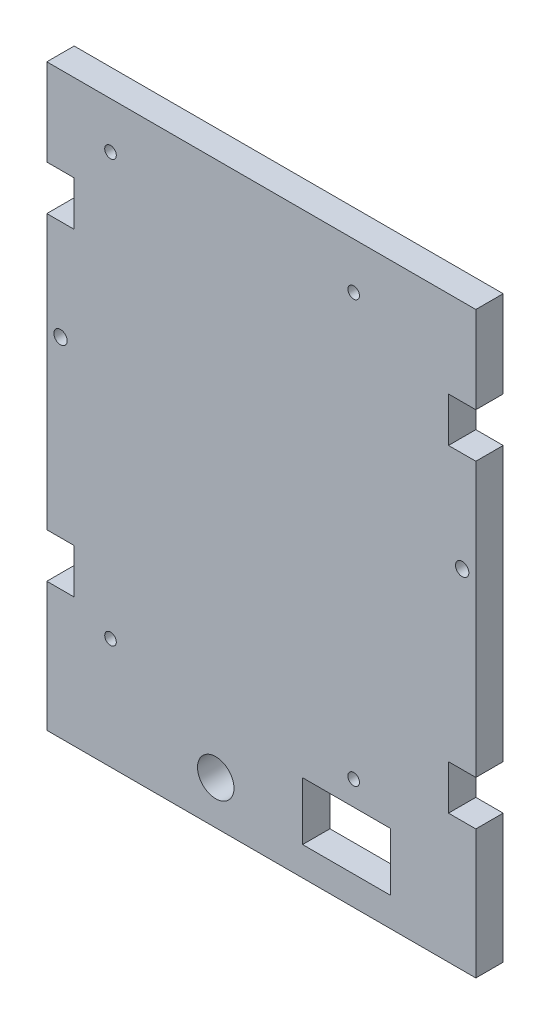
ISO-10303-21;
HEADER;
FILE_DESCRIPTION(('STEP AP214'),'2;1');
FILE_NAME('part.step','',(''),(''),'','','');
FILE_SCHEMA(('AUTOMOTIVE_DESIGN { 1 0 10303 214 1 1 1 1 }'));
ENDSEC;
DATA;
#1=APPLICATION_CONTEXT('core data for automotive mechanical design processes');
#2=APPLICATION_PROTOCOL_DEFINITION('international standard','automotive_design',2000,#1);
#3=PRODUCT_CONTEXT('',#1,'mechanical');
#4=PRODUCT('Part','Part','',(#3));
#5=PRODUCT_RELATED_PRODUCT_CATEGORY('part','',(#4));
#6=PRODUCT_DEFINITION_FORMATION('','',#4);
#7=PRODUCT_DEFINITION_CONTEXT('part definition',#1,'design');
#8=PRODUCT_DEFINITION('design','',#6,#7);
#9=PRODUCT_DEFINITION_SHAPE('','',#8);
#10=(LENGTH_UNIT() NAMED_UNIT(*) SI_UNIT(.MILLI.,.METRE.));
#11=(NAMED_UNIT(*) PLANE_ANGLE_UNIT() SI_UNIT($,.RADIAN.));
#12=(NAMED_UNIT(*) SI_UNIT($,.STERADIAN.) SOLID_ANGLE_UNIT());
#13=UNCERTAINTY_MEASURE_WITH_UNIT(LENGTH_MEASURE(1.E-05),#10,'distance_accuracy_value','');
#14=(GEOMETRIC_REPRESENTATION_CONTEXT(3) GLOBAL_UNCERTAINTY_ASSIGNED_CONTEXT((#13)) GLOBAL_UNIT_ASSIGNED_CONTEXT((#10,
#11,#12)) REPRESENTATION_CONTEXT('',''));
#15=CARTESIAN_POINT('',(0.,0.,0.));
#16=DIRECTION('',(0.,0.,1.));
#17=DIRECTION('',(1.,0.,0.));
#18=AXIS2_PLACEMENT_3D('',#15,#16,#17);
#19=CARTESIAN_POINT('',(94.107,0.,6.));
#20=DIRECTION('',(-1.,0.,0.));
#21=DIRECTION('',(0.,0.,1.));
#22=AXIS2_PLACEMENT_3D('',#19,#20,#21);
#23=PLANE('',#22);
#24=DIRECTION('',(0.,1.,0.));
#25=VECTOR('',#24,1.);
#26=CARTESIAN_POINT('',(94.107,0.,0.));
#27=LINE('',#26,#25);
#28=CARTESIAN_POINT('',(94.107,0.,0.));
#29=VERTEX_POINT('',#28);
#30=CARTESIAN_POINT('',(94.107,28.321,0.));
#31=VERTEX_POINT('',#30);
#32=EDGE_CURVE('E392',#29,#31,#27,.T.);
#33=ORIENTED_EDGE('',*,*,#32,.T.);
#34=DIRECTION('',(0.,0.,1.));
#35=VECTOR('',#34,1.);
#36=CARTESIAN_POINT('',(94.107,28.321,0.));
#37=LINE('',#36,#35);
#38=CARTESIAN_POINT('',(94.107,28.321,6.));
#39=VERTEX_POINT('',#38);
#40=EDGE_CURVE('E282',#31,#39,#37,.T.);
#41=ORIENTED_EDGE('',*,*,#40,.T.);
#42=DIRECTION('',(0.,1.,0.));
#43=VECTOR('',#42,1.);
#44=CARTESIAN_POINT('',(94.107,0.,6.));
#45=LINE('',#44,#43);
#46=CARTESIAN_POINT('',(94.107,0.,6.));
#47=VERTEX_POINT('',#46);
#48=EDGE_CURVE('E378',#47,#39,#45,.T.);
#49=ORIENTED_EDGE('',*,*,#48,.F.);
#50=DIRECTION('',(0.,0.,-1.));
#51=VECTOR('',#50,1.);
#52=CARTESIAN_POINT('',(94.107,0.,6.));
#53=LINE('',#52,#51);
#54=EDGE_CURVE('E41',#47,#29,#53,.T.);
#55=ORIENTED_EDGE('',*,*,#54,.T.);
#56=EDGE_LOOP('',(#33,#41,#49,#55));
#57=FACE_BOUND('',#56,.T.);
#58=ADVANCED_FACE('F33',(#57),#23,.F.);
#59=CARTESIAN_POINT('',(0.,0.,6.));
#60=DIRECTION('',(1.,0.,0.));
#61=DIRECTION('',(0.,0.,-1.));
#62=AXIS2_PLACEMENT_3D('',#59,#60,#61);
#63=PLANE('',#62);
#64=DIRECTION('',(0.,-1.,0.));
#65=VECTOR('',#64,1.);
#66=CARTESIAN_POINT('',(0.,0.,0.));
#67=LINE('',#66,#65);
#68=CARTESIAN_POINT('',(0.,98.171,0.));
#69=VERTEX_POINT('',#68);
#70=CARTESIAN_POINT('',(0.,38.1,0.));
#71=VERTEX_POINT('',#70);
#72=EDGE_CURVE('E389',#69,#71,#67,.T.);
#73=ORIENTED_EDGE('',*,*,#72,.T.);
#74=DIRECTION('',(0.,0.,1.));
#75=VECTOR('',#74,1.);
#76=CARTESIAN_POINT('',(0.,38.1,0.));
#77=LINE('',#76,#75);
#78=CARTESIAN_POINT('',(0.,38.1,6.));
#79=VERTEX_POINT('',#78);
#80=EDGE_CURVE('E308',#71,#79,#77,.T.);
#81=ORIENTED_EDGE('',*,*,#80,.T.);
#82=DIRECTION('',(0.,-1.,0.));
#83=VECTOR('',#82,1.);
#84=CARTESIAN_POINT('',(0.,0.,6.));
#85=LINE('',#84,#83);
#86=CARTESIAN_POINT('',(0.,98.171,6.));
#87=VERTEX_POINT('',#86);
#88=EDGE_CURVE('E374',#87,#79,#85,.T.);
#89=ORIENTED_EDGE('',*,*,#88,.F.);
#90=DIRECTION('',(0.,0.,1.));
#91=VECTOR('',#90,1.);
#92=CARTESIAN_POINT('',(0.,98.171,0.));
#93=LINE('',#92,#91);
#94=EDGE_CURVE('E354',#69,#87,#93,.T.);
#95=ORIENTED_EDGE('',*,*,#94,.F.);
#96=EDGE_LOOP('',(#73,#81,#89,#95));
#97=FACE_BOUND('',#96,.T.);
#98=ADVANCED_FACE('F429',(#97),#63,.F.);
#99=CARTESIAN_POINT('',(94.107,38.1,6.));
#100=VERTEX_POINT('',#99);
#101=CARTESIAN_POINT('',(94.107,98.171,6.));
#102=VERTEX_POINT('',#101);
#103=EDGE_CURVE('E382',#100,#102,#45,.T.);
#104=ORIENTED_EDGE('',*,*,#103,.F.);
#105=DIRECTION('',(0.,0.,1.));
#106=VECTOR('',#105,1.);
#107=CARTESIAN_POINT('',(94.107,38.1,0.));
#108=LINE('',#107,#106);
#109=CARTESIAN_POINT('',(94.107,38.1,0.));
#110=VERTEX_POINT('',#109);
#111=EDGE_CURVE('E275',#110,#100,#108,.T.);
#112=ORIENTED_EDGE('',*,*,#111,.F.);
#113=CARTESIAN_POINT('',(94.107,98.171,0.));
#114=VERTEX_POINT('',#113);
#115=EDGE_CURVE('E396',#110,#114,#27,.T.);
#116=ORIENTED_EDGE('',*,*,#115,.T.);
#117=DIRECTION('',(0.,0.,1.));
#118=VECTOR('',#117,1.);
#119=CARTESIAN_POINT('',(94.107,98.171,0.));
#120=LINE('',#119,#118);
#121=EDGE_CURVE('E335',#114,#102,#120,.T.);
#122=ORIENTED_EDGE('',*,*,#121,.T.);
#123=EDGE_LOOP('',(#104,#112,#116,#122));
#124=FACE_BOUND('',#123,.T.);
#125=ADVANCED_FACE('F465',(#124),#23,.F.);
#126=CARTESIAN_POINT('',(0.,127.,0.));
#127=VERTEX_POINT('',#126);
#128=CARTESIAN_POINT('',(0.,107.95,0.));
#129=VERTEX_POINT('',#128);
#130=EDGE_CURVE('E385',#127,#129,#67,.T.);
#131=ORIENTED_EDGE('',*,*,#130,.T.);
#132=DIRECTION('',(0.,0.,1.));
#133=VECTOR('',#132,1.);
#134=CARTESIAN_POINT('',(0.,107.95,0.));
#135=LINE('',#134,#133);
#136=CARTESIAN_POINT('',(0.,107.95,6.));
#137=VERTEX_POINT('',#136);
#138=EDGE_CURVE('E361',#129,#137,#135,.T.);
#139=ORIENTED_EDGE('',*,*,#138,.T.);
#140=CARTESIAN_POINT('',(0.,127.,6.));
#141=VERTEX_POINT('',#140);
#142=EDGE_CURVE('E370',#141,#137,#85,.T.);
#143=ORIENTED_EDGE('',*,*,#142,.F.);
#144=DIRECTION('',(0.,0.,-1.));
#145=VECTOR('',#144,1.);
#146=CARTESIAN_POINT('',(0.,127.,6.));
#147=LINE('',#146,#145);
#148=EDGE_CURVE('E384',#141,#127,#147,.T.);
#149=ORIENTED_EDGE('',*,*,#148,.T.);
#150=EDGE_LOOP('',(#131,#139,#143,#149));
#151=FACE_BOUND('',#150,.T.);
#152=ADVANCED_FACE('F450',(#151),#63,.F.);
#153=CARTESIAN_POINT('',(0.,28.321,6.));
#154=VERTEX_POINT('',#153);
#155=CARTESIAN_POINT('',(0.,0.,6.));
#156=VERTEX_POINT('',#155);
#157=EDGE_CURVE('E375',#154,#156,#85,.T.);
#158=ORIENTED_EDGE('',*,*,#157,.F.);
#159=DIRECTION('',(0.,0.,1.));
#160=VECTOR('',#159,1.);
#161=CARTESIAN_POINT('',(0.,28.321,0.));
#162=LINE('',#161,#160);
#163=CARTESIAN_POINT('',(0.,28.321,0.));
#164=VERTEX_POINT('',#163);
#165=EDGE_CURVE('E301',#164,#154,#162,.T.);
#166=ORIENTED_EDGE('',*,*,#165,.F.);
#167=CARTESIAN_POINT('',(0.,0.,0.));
#168=VERTEX_POINT('',#167);
#169=EDGE_CURVE('E364',#164,#168,#67,.T.);
#170=ORIENTED_EDGE('',*,*,#169,.T.);
#171=DIRECTION('',(0.,0.,-1.));
#172=VECTOR('',#171,1.);
#173=CARTESIAN_POINT('',(0.,0.,6.));
#174=LINE('',#173,#172);
#175=EDGE_CURVE('E11',#156,#168,#174,.T.);
#176=ORIENTED_EDGE('',*,*,#175,.F.);
#177=EDGE_LOOP('',(#158,#166,#170,#176));
#178=FACE_BOUND('',#177,.T.);
#179=ADVANCED_FACE('F35',(#178),#63,.F.);
#180=CARTESIAN_POINT('',(0.,0.,6.));
#181=DIRECTION('',(0.,1.,0.));
#182=DIRECTION('',(0.,0.,1.));
#183=AXIS2_PLACEMENT_3D('',#180,#181,#182);
#184=PLANE('',#183);
#185=DIRECTION('',(1.,0.,0.));
#186=VECTOR('',#185,1.);
#187=CARTESIAN_POINT('',(0.,0.,0.));
#188=LINE('',#187,#186);
#189=EDGE_CURVE('E388',#168,#29,#188,.T.);
#190=ORIENTED_EDGE('',*,*,#189,.T.);
#191=ORIENTED_EDGE('',*,*,#54,.F.);
#192=DIRECTION('',(1.,0.,0.));
#193=VECTOR('',#192,1.);
#194=CARTESIAN_POINT('',(0.,0.,6.));
#195=LINE('',#194,#193);
#196=EDGE_CURVE('E373',#156,#47,#195,.T.);
#197=ORIENTED_EDGE('',*,*,#196,.F.);
#198=ORIENTED_EDGE('',*,*,#175,.T.);
#199=EDGE_LOOP('',(#190,#191,#197,#198));
#200=FACE_BOUND('',#199,.T.);
#201=ADVANCED_FACE('F422',(#200),#184,.F.);
#202=CARTESIAN_POINT('',(94.107,107.95,6.));
#203=VERTEX_POINT('',#202);
#204=CARTESIAN_POINT('',(94.107,127.,6.));
#205=VERTEX_POINT('',#204);
#206=EDGE_CURVE('E377',#203,#205,#45,.T.);
#207=ORIENTED_EDGE('',*,*,#206,.F.);
#208=DIRECTION('',(0.,0.,1.));
#209=VECTOR('',#208,1.);
#210=CARTESIAN_POINT('',(94.107,107.95,0.));
#211=LINE('',#210,#209);
#212=CARTESIAN_POINT('',(94.107,107.95,0.));
#213=VERTEX_POINT('',#212);
#214=EDGE_CURVE('E327',#213,#203,#211,.T.);
#215=ORIENTED_EDGE('',*,*,#214,.F.);
#216=CARTESIAN_POINT('',(94.107,127.,0.));
#217=VERTEX_POINT('',#216);
#218=EDGE_CURVE('E391',#213,#217,#27,.T.);
#219=ORIENTED_EDGE('',*,*,#218,.T.);
#220=DIRECTION('',(0.,0.,-1.));
#221=VECTOR('',#220,1.);
#222=CARTESIAN_POINT('',(94.107,127.,6.));
#223=LINE('',#222,#221);
#224=EDGE_CURVE('E400',#205,#217,#223,.T.);
#225=ORIENTED_EDGE('',*,*,#224,.F.);
#226=EDGE_LOOP('',(#207,#215,#219,#225));
#227=FACE_BOUND('',#226,.T.);
#228=ADVANCED_FACE('F479',(#227),#23,.F.);
#229=CARTESIAN_POINT('',(0.,127.,6.));
#230=DIRECTION('',(0.,-1.,0.));
#231=DIRECTION('',(0.,0.,-1.));
#232=AXIS2_PLACEMENT_3D('',#229,#230,#231);
#233=PLANE('',#232);
#234=DIRECTION('',(-1.,0.,0.));
#235=VECTOR('',#234,1.);
#236=CARTESIAN_POINT('',(0.,127.,0.));
#237=LINE('',#236,#235);
#238=EDGE_CURVE('E395',#217,#127,#237,.T.);
#239=ORIENTED_EDGE('',*,*,#238,.T.);
#240=ORIENTED_EDGE('',*,*,#148,.F.);
#241=DIRECTION('',(-1.,0.,0.));
#242=VECTOR('',#241,1.);
#243=CARTESIAN_POINT('',(0.,127.,6.));
#244=LINE('',#243,#242);
#245=EDGE_CURVE('E381',#205,#141,#244,.T.);
#246=ORIENTED_EDGE('',*,*,#245,.F.);
#247=ORIENTED_EDGE('',*,*,#224,.T.);
#248=EDGE_LOOP('',(#239,#240,#246,#247));
#249=FACE_BOUND('',#248,.T.);
#250=ADVANCED_FACE('F455',(#249),#233,.F.);
#251=CARTESIAN_POINT('',(0.,127.,6.));
#252=DIRECTION('',(0.,0.,-1.));
#253=DIRECTION('',(-1.,0.,0.));
#254=AXIS2_PLACEMENT_3D('',#251,#252,#253);
#255=PLANE('',#254);
#256=CARTESIAN_POINT('',(91.1098,76.2,6.));
#257=DIRECTION('',(0.,0.,1.));
#258=DIRECTION('',(1.,0.,0.));
#259=AXIS2_PLACEMENT_3D('',#256,#257,#258);
#260=CIRCLE('',#259,1.4605);
#261=CARTESIAN_POINT('',(92.5703,76.2,6.));
#262=VERTEX_POINT('',#261);
#263=EDGE_CURVE('E762',#262,#262,#260,.T.);
#264=ORIENTED_EDGE('',*,*,#263,.F.);
#265=EDGE_LOOP('',(#264));
#266=FACE_BOUND('',#265,.T.);
#267=CARTESIAN_POINT('',(2.9972,76.2,6.));
#268=DIRECTION('',(0.,0.,1.));
#269=DIRECTION('',(1.,0.,0.));
#270=AXIS2_PLACEMENT_3D('',#267,#268,#269);
#271=CIRCLE('',#270,1.4605);
#272=CARTESIAN_POINT('',(4.4577,76.2,6.));
#273=VERTEX_POINT('',#272);
#274=EDGE_CURVE('E218',#273,#273,#271,.T.);
#275=ORIENTED_EDGE('',*,*,#274,.F.);
#276=EDGE_LOOP('',(#275));
#277=FACE_BOUND('',#276,.T.);
#278=DIRECTION('',(1.,0.,0.));
#279=VECTOR('',#278,1.);
#280=CARTESIAN_POINT('',(56.1086,6.35,6.));
#281=LINE('',#280,#279);
#282=CARTESIAN_POINT('',(56.1086,6.35,6.));
#283=VERTEX_POINT('',#282);
#284=CARTESIAN_POINT('',(75.4126,6.35,6.));
#285=VERTEX_POINT('',#284);
#286=EDGE_CURVE('E224',#283,#285,#281,.T.);
#287=ORIENTED_EDGE('',*,*,#286,.F.);
#288=DIRECTION('',(0.,-1.,0.));
#289=VECTOR('',#288,1.);
#290=CARTESIAN_POINT('',(56.1086,19.05,6.));
#291=LINE('',#290,#289);
#292=CARTESIAN_POINT('',(56.1086,19.05,6.));
#293=VERTEX_POINT('',#292);
#294=EDGE_CURVE('E48',#293,#283,#291,.T.);
#295=ORIENTED_EDGE('',*,*,#294,.F.);
#296=DIRECTION('',(-1.,0.,0.));
#297=VECTOR('',#296,1.);
#298=CARTESIAN_POINT('',(56.1086,19.05,6.));
#299=LINE('',#298,#297);
#300=CARTESIAN_POINT('',(75.4126,19.05,6.));
#301=VERTEX_POINT('',#300);
#302=EDGE_CURVE('E212',#301,#293,#299,.T.);
#303=ORIENTED_EDGE('',*,*,#302,.F.);
#304=DIRECTION('',(0.,1.,0.));
#305=VECTOR('',#304,1.);
#306=CARTESIAN_POINT('',(75.4126,19.05,6.));
#307=LINE('',#306,#305);
#308=EDGE_CURVE('E215',#285,#301,#307,.T.);
#309=ORIENTED_EDGE('',*,*,#308,.F.);
#310=EDGE_LOOP('',(#287,#295,#303,#309));
#311=FACE_BOUND('',#310,.T.);
#312=CARTESIAN_POINT('',(37.0586,9.525,6.));
#313=DIRECTION('',(0.,0.,1.));
#314=DIRECTION('',(1.,0.,0.));
#315=AXIS2_PLACEMENT_3D('',#312,#313,#314);
#316=CIRCLE('',#315,4.00049999999999);
#317=CARTESIAN_POINT('',(41.0591,9.525,6.));
#318=VERTEX_POINT('',#317);
#319=EDGE_CURVE('E231',#318,#318,#316,.T.);
#320=ORIENTED_EDGE('',*,*,#319,.F.);
#321=EDGE_LOOP('',(#320));
#322=FACE_BOUND('',#321,.T.);
#323=CARTESIAN_POINT('',(13.97,24.384,6.));
#324=DIRECTION('',(0.,0.,-1.));
#325=DIRECTION('',(-1.,0.,0.));
#326=AXIS2_PLACEMENT_3D('',#323,#324,#325);
#327=CIRCLE('',#326,1.27);
#328=CARTESIAN_POINT('',(12.7,24.384,6.));
#329=VERTEX_POINT('',#328);
#330=EDGE_CURVE('E241',#329,#329,#327,.T.);
#331=ORIENTED_EDGE('',*,*,#330,.T.);
#332=EDGE_LOOP('',(#331));
#333=FACE_BOUND('',#332,.T.);
#334=CARTESIAN_POINT('',(13.97,116.84,6.));
#335=DIRECTION('',(0.,0.,-1.));
#336=DIRECTION('',(-1.,0.,0.));
#337=AXIS2_PLACEMENT_3D('',#334,#335,#336);
#338=CIRCLE('',#337,1.27);
#339=CARTESIAN_POINT('',(12.7,116.84,6.));
#340=VERTEX_POINT('',#339);
#341=EDGE_CURVE('E247',#340,#340,#338,.T.);
#342=ORIENTED_EDGE('',*,*,#341,.T.);
#343=EDGE_LOOP('',(#342));
#344=FACE_BOUND('',#343,.T.);
#345=CARTESIAN_POINT('',(67.31,116.84,6.));
#346=DIRECTION('',(0.,0.,-1.));
#347=DIRECTION('',(-1.,0.,0.));
#348=AXIS2_PLACEMENT_3D('',#345,#346,#347);
#349=CIRCLE('',#348,1.26999999999999);
#350=CARTESIAN_POINT('',(66.04,116.84,6.));
#351=VERTEX_POINT('',#350);
#352=EDGE_CURVE('E253',#351,#351,#349,.T.);
#353=ORIENTED_EDGE('',*,*,#352,.T.);
#354=EDGE_LOOP('',(#353));
#355=FACE_BOUND('',#354,.T.);
#356=CARTESIAN_POINT('',(67.31,24.384,6.));
#357=DIRECTION('',(0.,0.,-1.));
#358=DIRECTION('',(-1.,0.,0.));
#359=AXIS2_PLACEMENT_3D('',#356,#357,#358);
#360=CIRCLE('',#359,1.26999999999999);
#361=CARTESIAN_POINT('',(66.04,24.384,6.));
#362=VERTEX_POINT('',#361);
#363=EDGE_CURVE('E259',#362,#362,#360,.T.);
#364=ORIENTED_EDGE('',*,*,#363,.T.);
#365=EDGE_LOOP('',(#364));
#366=FACE_BOUND('',#365,.T.);
#367=ORIENTED_EDGE('',*,*,#48,.T.);
#368=DIRECTION('',(1.,0.,0.));
#369=VECTOR('',#368,1.);
#370=CARTESIAN_POINT('',(94.107,28.321,6.));
#371=LINE('',#370,#369);
#372=CARTESIAN_POINT('',(88.1126,28.321,6.));
#373=VERTEX_POINT('',#372);
#374=EDGE_CURVE('E269',#373,#39,#371,.T.);
#375=ORIENTED_EDGE('',*,*,#374,.F.);
#376=DIRECTION('',(0.,-1.,0.));
#377=VECTOR('',#376,1.);
#378=CARTESIAN_POINT('',(88.1126,38.1,6.));
#379=LINE('',#378,#377);
#380=CARTESIAN_POINT('',(88.1126,38.1,6.));
#381=VERTEX_POINT('',#380);
#382=EDGE_CURVE('E278',#381,#373,#379,.T.);
#383=ORIENTED_EDGE('',*,*,#382,.F.);
#384=DIRECTION('',(-1.,0.,0.));
#385=VECTOR('',#384,1.);
#386=CARTESIAN_POINT('',(94.107,38.1,6.));
#387=LINE('',#386,#385);
#388=EDGE_CURVE('E262',#100,#381,#387,.T.);
#389=ORIENTED_EDGE('',*,*,#388,.F.);
#390=ORIENTED_EDGE('',*,*,#103,.T.);
#391=DIRECTION('',(1.,0.,0.));
#392=VECTOR('',#391,1.);
#393=CARTESIAN_POINT('',(94.107,98.171,6.));
#394=LINE('',#393,#392);
#395=CARTESIAN_POINT('',(88.1126,98.171,6.));
#396=VERTEX_POINT('',#395);
#397=EDGE_CURVE('E321',#396,#102,#394,.T.);
#398=ORIENTED_EDGE('',*,*,#397,.F.);
#399=DIRECTION('',(0.,-1.,0.));
#400=VECTOR('',#399,1.);
#401=CARTESIAN_POINT('',(88.1126,107.95,6.));
#402=LINE('',#401,#400);
#403=CARTESIAN_POINT('',(88.1126,107.95,6.));
#404=VERTEX_POINT('',#403);
#405=EDGE_CURVE('E330',#404,#396,#402,.T.);
#406=ORIENTED_EDGE('',*,*,#405,.F.);
#407=DIRECTION('',(-1.,0.,0.));
#408=VECTOR('',#407,1.);
#409=CARTESIAN_POINT('',(94.107,107.95,6.));
#410=LINE('',#409,#408);
#411=EDGE_CURVE('E311',#203,#404,#410,.T.);
#412=ORIENTED_EDGE('',*,*,#411,.F.);
#413=ORIENTED_EDGE('',*,*,#206,.T.);
#414=ORIENTED_EDGE('',*,*,#245,.T.);
#415=ORIENTED_EDGE('',*,*,#142,.T.);
#416=DIRECTION('',(-1.,0.,0.));
#417=VECTOR('',#416,1.);
#418=CARTESIAN_POINT('',(0.,107.95,6.));
#419=LINE('',#418,#417);
#420=CARTESIAN_POINT('',(5.9944,107.95,6.));
#421=VERTEX_POINT('',#420);
#422=EDGE_CURVE('E348',#421,#137,#419,.T.);
#423=ORIENTED_EDGE('',*,*,#422,.F.);
#424=DIRECTION('',(0.,1.,0.));
#425=VECTOR('',#424,1.);
#426=CARTESIAN_POINT('',(5.9944,107.95,6.));
#427=LINE('',#426,#425);
#428=CARTESIAN_POINT('',(5.9944,98.171,6.));
#429=VERTEX_POINT('',#428);
#430=EDGE_CURVE('E357',#429,#421,#427,.T.);
#431=ORIENTED_EDGE('',*,*,#430,.F.);
#432=DIRECTION('',(1.,0.,0.));
#433=VECTOR('',#432,1.);
#434=CARTESIAN_POINT('',(0.,98.171,6.));
#435=LINE('',#434,#433);
#436=EDGE_CURVE('E338',#87,#429,#435,.T.);
#437=ORIENTED_EDGE('',*,*,#436,.F.);
#438=ORIENTED_EDGE('',*,*,#88,.T.);
#439=DIRECTION('',(-1.,0.,0.));
#440=VECTOR('',#439,1.);
#441=CARTESIAN_POINT('',(0.,38.1,6.));
#442=LINE('',#441,#440);
#443=CARTESIAN_POINT('',(5.99440000000001,38.1,6.));
#444=VERTEX_POINT('',#443);
#445=EDGE_CURVE('E295',#444,#79,#442,.T.);
#446=ORIENTED_EDGE('',*,*,#445,.F.);
#447=DIRECTION('',(0.,1.,0.));
#448=VECTOR('',#447,1.);
#449=CARTESIAN_POINT('',(5.99440000000001,38.1,6.));
#450=LINE('',#449,#448);
#451=CARTESIAN_POINT('',(5.99440000000001,28.321,6.));
#452=VERTEX_POINT('',#451);
#453=EDGE_CURVE('E304',#452,#444,#450,.T.);
#454=ORIENTED_EDGE('',*,*,#453,.F.);
#455=DIRECTION('',(1.,0.,0.));
#456=VECTOR('',#455,1.);
#457=CARTESIAN_POINT('',(0.,28.321,6.));
#458=LINE('',#457,#456);
#459=EDGE_CURVE('E285',#154,#452,#458,.T.);
#460=ORIENTED_EDGE('',*,*,#459,.F.);
#461=ORIENTED_EDGE('',*,*,#157,.T.);
#462=ORIENTED_EDGE('',*,*,#196,.T.);
#463=EDGE_LOOP('',(#367,#375,#383,#389,#390,#398,#406,#412,#413,#414,#415,#423,#431,#437,#438,
#446,#454,#460,#461,#462));
#464=FACE_BOUND('',#463,.T.);
#465=ADVANCED_FACE('F417',(#266,#277,#311,#322,#333,#344,#355,#366,#464),#255,.F.);
#466=CARTESIAN_POINT('',(0.,127.,0.));
#467=DIRECTION('',(0.,0.,-1.));
#468=DIRECTION('',(-1.,0.,0.));
#469=AXIS2_PLACEMENT_3D('',#466,#467,#468);
#470=PLANE('',#469);
#471=CARTESIAN_POINT('',(91.1098,76.2,0.));
#472=DIRECTION('',(0.,0.,1.));
#473=DIRECTION('',(1.,0.,0.));
#474=AXIS2_PLACEMENT_3D('',#471,#472,#473);
#475=CIRCLE('',#474,1.4605);
#476=CARTESIAN_POINT('',(92.5703,76.2,0.));
#477=VERTEX_POINT('',#476);
#478=EDGE_CURVE('E759',#477,#477,#475,.T.);
#479=ORIENTED_EDGE('',*,*,#478,.T.);
#480=EDGE_LOOP('',(#479));
#481=FACE_BOUND('',#480,.T.);
#482=CARTESIAN_POINT('',(2.9972,76.2,0.));
#483=DIRECTION('',(0.,0.,1.));
#484=DIRECTION('',(1.,0.,0.));
#485=AXIS2_PLACEMENT_3D('',#482,#483,#484);
#486=CIRCLE('',#485,1.4605);
#487=CARTESIAN_POINT('',(4.4577,76.2,0.));
#488=VERTEX_POINT('',#487);
#489=EDGE_CURVE('E225',#488,#488,#486,.T.);
#490=ORIENTED_EDGE('',*,*,#489,.T.);
#491=EDGE_LOOP('',(#490));
#492=FACE_BOUND('',#491,.T.);
#493=DIRECTION('',(0.,-1.,0.));
#494=VECTOR('',#493,1.);
#495=CARTESIAN_POINT('',(56.1086,19.05,0.));
#496=LINE('',#495,#494);
#497=CARTESIAN_POINT('',(56.1086,19.05,0.));
#498=VERTEX_POINT('',#497);
#499=CARTESIAN_POINT('',(56.1086,6.35,0.));
#500=VERTEX_POINT('',#499);
#501=EDGE_CURVE('E196',#498,#500,#496,.T.);
#502=ORIENTED_EDGE('',*,*,#501,.T.);
#503=DIRECTION('',(1.,0.,0.));
#504=VECTOR('',#503,1.);
#505=CARTESIAN_POINT('',(56.1086,6.35,0.));
#506=LINE('',#505,#504);
#507=CARTESIAN_POINT('',(75.4126,6.35,0.));
#508=VERTEX_POINT('',#507);
#509=EDGE_CURVE('E205',#500,#508,#506,.T.);
#510=ORIENTED_EDGE('',*,*,#509,.T.);
#511=DIRECTION('',(0.,1.,0.));
#512=VECTOR('',#511,1.);
#513=CARTESIAN_POINT('',(75.4126,19.05,0.));
#514=LINE('',#513,#512);
#515=CARTESIAN_POINT('',(75.4126,19.05,0.));
#516=VERTEX_POINT('',#515);
#517=EDGE_CURVE('E56',#508,#516,#514,.T.);
#518=ORIENTED_EDGE('',*,*,#517,.T.);
#519=DIRECTION('',(-1.,0.,0.));
#520=VECTOR('',#519,1.);
#521=CARTESIAN_POINT('',(56.1086,19.05,0.));
#522=LINE('',#521,#520);
#523=EDGE_CURVE('E202',#516,#498,#522,.T.);
#524=ORIENTED_EDGE('',*,*,#523,.T.);
#525=EDGE_LOOP('',(#502,#510,#518,#524));
#526=FACE_BOUND('',#525,.T.);
#527=CARTESIAN_POINT('',(37.0586,9.525,0.));
#528=DIRECTION('',(0.,0.,1.));
#529=DIRECTION('',(1.,0.,0.));
#530=AXIS2_PLACEMENT_3D('',#527,#528,#529);
#531=CIRCLE('',#530,4.00049999999999);
#532=CARTESIAN_POINT('',(41.0591,9.525,0.));
#533=VERTEX_POINT('',#532);
#534=EDGE_CURVE('E235',#533,#533,#531,.T.);
#535=ORIENTED_EDGE('',*,*,#534,.T.);
#536=EDGE_LOOP('',(#535));
#537=FACE_BOUND('',#536,.T.);
#538=CARTESIAN_POINT('',(13.97,24.384,0.));
#539=DIRECTION('',(0.,0.,-1.));
#540=DIRECTION('',(-1.,0.,0.));
#541=AXIS2_PLACEMENT_3D('',#538,#539,#540);
#542=CIRCLE('',#541,1.27);
#543=CARTESIAN_POINT('',(12.7,24.384,0.));
#544=VERTEX_POINT('',#543);
#545=EDGE_CURVE('E238',#544,#544,#542,.T.);
#546=ORIENTED_EDGE('',*,*,#545,.F.);
#547=EDGE_LOOP('',(#546));
#548=FACE_BOUND('',#547,.T.);
#549=CARTESIAN_POINT('',(13.97,116.84,0.));
#550=DIRECTION('',(0.,0.,-1.));
#551=DIRECTION('',(-1.,0.,0.));
#552=AXIS2_PLACEMENT_3D('',#549,#550,#551);
#553=CIRCLE('',#552,1.27);
#554=CARTESIAN_POINT('',(12.7,116.84,0.));
#555=VERTEX_POINT('',#554);
#556=EDGE_CURVE('E244',#555,#555,#553,.T.);
#557=ORIENTED_EDGE('',*,*,#556,.F.);
#558=EDGE_LOOP('',(#557));
#559=FACE_BOUND('',#558,.T.);
#560=CARTESIAN_POINT('',(67.31,116.84,0.));
#561=DIRECTION('',(0.,0.,-1.));
#562=DIRECTION('',(-1.,0.,0.));
#563=AXIS2_PLACEMENT_3D('',#560,#561,#562);
#564=CIRCLE('',#563,1.26999999999999);
#565=CARTESIAN_POINT('',(66.04,116.84,0.));
#566=VERTEX_POINT('',#565);
#567=EDGE_CURVE('E250',#566,#566,#564,.T.);
#568=ORIENTED_EDGE('',*,*,#567,.F.);
#569=EDGE_LOOP('',(#568));
#570=FACE_BOUND('',#569,.T.);
#571=CARTESIAN_POINT('',(67.31,24.384,0.));
#572=DIRECTION('',(0.,0.,-1.));
#573=DIRECTION('',(-1.,0.,0.));
#574=AXIS2_PLACEMENT_3D('',#571,#572,#573);
#575=CIRCLE('',#574,1.26999999999999);
#576=CARTESIAN_POINT('',(66.04,24.384,0.));
#577=VERTEX_POINT('',#576);
#578=EDGE_CURVE('E256',#577,#577,#575,.T.);
#579=ORIENTED_EDGE('',*,*,#578,.F.);
#580=EDGE_LOOP('',(#579));
#581=FACE_BOUND('',#580,.T.);
#582=DIRECTION('',(1.,0.,0.));
#583=VECTOR('',#582,1.);
#584=CARTESIAN_POINT('',(94.107,28.321,0.));
#585=LINE('',#584,#583);
#586=CARTESIAN_POINT('',(88.1126,28.321,0.));
#587=VERTEX_POINT('',#586);
#588=EDGE_CURVE('E272',#587,#31,#585,.T.);
#589=ORIENTED_EDGE('',*,*,#588,.T.);
#590=ORIENTED_EDGE('',*,*,#32,.F.);
#591=ORIENTED_EDGE('',*,*,#189,.F.);
#592=ORIENTED_EDGE('',*,*,#169,.F.);
#593=DIRECTION('',(1.,0.,0.));
#594=VECTOR('',#593,1.);
#595=CARTESIAN_POINT('',(0.,28.321,0.));
#596=LINE('',#595,#594);
#597=CARTESIAN_POINT('',(5.99440000000001,28.321,0.));
#598=VERTEX_POINT('',#597);
#599=EDGE_CURVE('E291',#164,#598,#596,.T.);
#600=ORIENTED_EDGE('',*,*,#599,.T.);
#601=DIRECTION('',(0.,1.,0.));
#602=VECTOR('',#601,1.);
#603=CARTESIAN_POINT('',(5.99440000000001,38.1,0.));
#604=LINE('',#603,#602);
#605=CARTESIAN_POINT('',(5.99440000000001,38.1,0.));
#606=VERTEX_POINT('',#605);
#607=EDGE_CURVE('E294',#598,#606,#604,.T.);
#608=ORIENTED_EDGE('',*,*,#607,.T.);
#609=DIRECTION('',(-1.,0.,0.));
#610=VECTOR('',#609,1.);
#611=CARTESIAN_POINT('',(0.,38.1,0.));
#612=LINE('',#611,#610);
#613=EDGE_CURVE('E298',#606,#71,#612,.T.);
#614=ORIENTED_EDGE('',*,*,#613,.T.);
#615=ORIENTED_EDGE('',*,*,#72,.F.);
#616=DIRECTION('',(1.,0.,0.));
#617=VECTOR('',#616,1.);
#618=CARTESIAN_POINT('',(0.,98.171,0.));
#619=LINE('',#618,#617);
#620=CARTESIAN_POINT('',(5.9944,98.171,0.));
#621=VERTEX_POINT('',#620);
#622=EDGE_CURVE('E344',#69,#621,#619,.T.);
#623=ORIENTED_EDGE('',*,*,#622,.T.);
#624=DIRECTION('',(0.,1.,0.));
#625=VECTOR('',#624,1.);
#626=CARTESIAN_POINT('',(5.9944,107.95,0.));
#627=LINE('',#626,#625);
#628=CARTESIAN_POINT('',(5.9944,107.95,0.));
#629=VERTEX_POINT('',#628);
#630=EDGE_CURVE('E347',#621,#629,#627,.T.);
#631=ORIENTED_EDGE('',*,*,#630,.T.);
#632=DIRECTION('',(-1.,0.,0.));
#633=VECTOR('',#632,1.);
#634=CARTESIAN_POINT('',(0.,107.95,0.));
#635=LINE('',#634,#633);
#636=EDGE_CURVE('E351',#629,#129,#635,.T.);
#637=ORIENTED_EDGE('',*,*,#636,.T.);
#638=ORIENTED_EDGE('',*,*,#130,.F.);
#639=ORIENTED_EDGE('',*,*,#238,.F.);
#640=ORIENTED_EDGE('',*,*,#218,.F.);
#641=DIRECTION('',(-1.,0.,0.));
#642=VECTOR('',#641,1.);
#643=CARTESIAN_POINT('',(94.107,107.95,0.));
#644=LINE('',#643,#642);
#645=CARTESIAN_POINT('',(88.1126,107.95,0.));
#646=VERTEX_POINT('',#645);
#647=EDGE_CURVE('E317',#213,#646,#644,.T.);
#648=ORIENTED_EDGE('',*,*,#647,.T.);
#649=DIRECTION('',(0.,-1.,0.));
#650=VECTOR('',#649,1.);
#651=CARTESIAN_POINT('',(88.1126,107.95,0.));
#652=LINE('',#651,#650);
#653=CARTESIAN_POINT('',(88.1126,98.171,0.));
#654=VERTEX_POINT('',#653);
#655=EDGE_CURVE('E320',#646,#654,#652,.T.);
#656=ORIENTED_EDGE('',*,*,#655,.T.);
#657=DIRECTION('',(1.,0.,0.));
#658=VECTOR('',#657,1.);
#659=CARTESIAN_POINT('',(94.107,98.171,0.));
#660=LINE('',#659,#658);
#661=EDGE_CURVE('E324',#654,#114,#660,.T.);
#662=ORIENTED_EDGE('',*,*,#661,.T.);
#663=ORIENTED_EDGE('',*,*,#115,.F.);
#664=DIRECTION('',(-1.,0.,0.));
#665=VECTOR('',#664,1.);
#666=CARTESIAN_POINT('',(94.107,38.1,0.));
#667=LINE('',#666,#665);
#668=CARTESIAN_POINT('',(88.1126,38.1,0.));
#669=VERTEX_POINT('',#668);
#670=EDGE_CURVE('E265',#110,#669,#667,.T.);
#671=ORIENTED_EDGE('',*,*,#670,.T.);
#672=DIRECTION('',(0.,-1.,0.));
#673=VECTOR('',#672,1.);
#674=CARTESIAN_POINT('',(88.1126,38.1,0.));
#675=LINE('',#674,#673);
#676=EDGE_CURVE('E268',#669,#587,#675,.T.);
#677=ORIENTED_EDGE('',*,*,#676,.T.);
#678=EDGE_LOOP('',(#589,#590,#591,#592,#600,#608,#614,#615,#623,#631,#637,#638,#639,#640,#648,
#656,#662,#663,#671,#677));
#679=FACE_BOUND('',#678,.T.);
#680=ADVANCED_FACE('F209',(#481,#492,#526,#537,#548,#559,#570,#581,#679),#470,.T.);
#681=CARTESIAN_POINT('',(0.,107.95,0.));
#682=DIRECTION('',(0.,1.,0.));
#683=DIRECTION('',(0.,0.,1.));
#684=AXIS2_PLACEMENT_3D('',#681,#682,#683);
#685=PLANE('',#684);
#686=ORIENTED_EDGE('',*,*,#422,.T.);
#687=ORIENTED_EDGE('',*,*,#138,.F.);
#688=ORIENTED_EDGE('',*,*,#636,.F.);
#689=DIRECTION('',(0.,0.,1.));
#690=VECTOR('',#689,1.);
#691=CARTESIAN_POINT('',(5.9944,107.95,0.));
#692=LINE('',#691,#690);
#693=EDGE_CURVE('E365',#629,#421,#692,.T.);
#694=ORIENTED_EDGE('',*,*,#693,.T.);
#695=EDGE_LOOP('',(#686,#687,#688,#694));
#696=FACE_BOUND('',#695,.T.);
#697=ADVANCED_FACE('F541',(#696),#685,.F.);
#698=CARTESIAN_POINT('',(5.9944,107.95,0.));
#699=DIRECTION('',(1.,0.,0.));
#700=DIRECTION('',(0.,1.,0.));
#701=AXIS2_PLACEMENT_3D('',#698,#699,#700);
#702=PLANE('',#701);
#703=ORIENTED_EDGE('',*,*,#430,.T.);
#704=ORIENTED_EDGE('',*,*,#693,.F.);
#705=ORIENTED_EDGE('',*,*,#630,.F.);
#706=DIRECTION('',(0.,0.,1.));
#707=VECTOR('',#706,1.);
#708=CARTESIAN_POINT('',(5.9944,98.171,0.));
#709=LINE('',#708,#707);
#710=EDGE_CURVE('E367',#621,#429,#709,.T.);
#711=ORIENTED_EDGE('',*,*,#710,.T.);
#712=EDGE_LOOP('',(#703,#704,#705,#711));
#713=FACE_BOUND('',#712,.T.);
#714=ADVANCED_FACE('F444',(#713),#702,.F.);
#715=CARTESIAN_POINT('',(0.,98.171,0.));
#716=DIRECTION('',(0.,-1.,0.));
#717=DIRECTION('',(0.,0.,-1.));
#718=AXIS2_PLACEMENT_3D('',#715,#716,#717);
#719=PLANE('',#718);
#720=ORIENTED_EDGE('',*,*,#436,.T.);
#721=ORIENTED_EDGE('',*,*,#710,.F.);
#722=ORIENTED_EDGE('',*,*,#622,.F.);
#723=ORIENTED_EDGE('',*,*,#94,.T.);
#724=EDGE_LOOP('',(#720,#721,#722,#723));
#725=FACE_BOUND('',#724,.T.);
#726=ADVANCED_FACE('F442',(#725),#719,.F.);
#727=CARTESIAN_POINT('',(94.107,98.171,0.));
#728=DIRECTION('',(0.,-1.,0.));
#729=DIRECTION('',(0.,0.,-1.));
#730=AXIS2_PLACEMENT_3D('',#727,#728,#729);
#731=PLANE('',#730);
#732=ORIENTED_EDGE('',*,*,#397,.T.);
#733=ORIENTED_EDGE('',*,*,#121,.F.);
#734=ORIENTED_EDGE('',*,*,#661,.F.);
#735=DIRECTION('',(0.,0.,1.));
#736=VECTOR('',#735,1.);
#737=CARTESIAN_POINT('',(88.1126,98.171,0.));
#738=LINE('',#737,#736);
#739=EDGE_CURVE('E339',#654,#396,#738,.T.);
#740=ORIENTED_EDGE('',*,*,#739,.T.);
#741=EDGE_LOOP('',(#732,#733,#734,#740));
#742=FACE_BOUND('',#741,.T.);
#743=ADVANCED_FACE('F468',(#742),#731,.F.);
#744=CARTESIAN_POINT('',(88.1126,107.95,0.));
#745=DIRECTION('',(-1.,0.,0.));
#746=DIRECTION('',(0.,0.,1.));
#747=AXIS2_PLACEMENT_3D('',#744,#745,#746);
#748=PLANE('',#747);
#749=ORIENTED_EDGE('',*,*,#405,.T.);
#750=ORIENTED_EDGE('',*,*,#739,.F.);
#751=ORIENTED_EDGE('',*,*,#655,.F.);
#752=DIRECTION('',(0.,0.,1.));
#753=VECTOR('',#752,1.);
#754=CARTESIAN_POINT('',(88.1126,107.95,0.));
#755=LINE('',#754,#753);
#756=EDGE_CURVE('E341',#646,#404,#755,.T.);
#757=ORIENTED_EDGE('',*,*,#756,.T.);
#758=EDGE_LOOP('',(#749,#750,#751,#757));
#759=FACE_BOUND('',#758,.T.);
#760=ADVANCED_FACE('F472',(#759),#748,.F.);
#761=CARTESIAN_POINT('',(94.107,107.95,0.));
#762=DIRECTION('',(0.,1.,0.));
#763=DIRECTION('',(0.,0.,1.));
#764=AXIS2_PLACEMENT_3D('',#761,#762,#763);
#765=PLANE('',#764);
#766=ORIENTED_EDGE('',*,*,#411,.T.);
#767=ORIENTED_EDGE('',*,*,#756,.F.);
#768=ORIENTED_EDGE('',*,*,#647,.F.);
#769=ORIENTED_EDGE('',*,*,#214,.T.);
#770=EDGE_LOOP('',(#766,#767,#768,#769));
#771=FACE_BOUND('',#770,.T.);
#772=ADVANCED_FACE('F474',(#771),#765,.F.);
#773=CARTESIAN_POINT('',(0.,38.1,0.));
#774=DIRECTION('',(0.,1.,0.));
#775=DIRECTION('',(0.,0.,1.));
#776=AXIS2_PLACEMENT_3D('',#773,#774,#775);
#777=PLANE('',#776);
#778=ORIENTED_EDGE('',*,*,#445,.T.);
#779=ORIENTED_EDGE('',*,*,#80,.F.);
#780=ORIENTED_EDGE('',*,*,#613,.F.);
#781=DIRECTION('',(0.,0.,1.));
#782=VECTOR('',#781,1.);
#783=CARTESIAN_POINT('',(5.99440000000001,38.1,0.));
#784=LINE('',#783,#782);
#785=EDGE_CURVE('E312',#606,#444,#784,.T.);
#786=ORIENTED_EDGE('',*,*,#785,.T.);
#787=EDGE_LOOP('',(#778,#779,#780,#786));
#788=FACE_BOUND('',#787,.T.);
#789=ADVANCED_FACE('F434',(#788),#777,.F.);
#790=CARTESIAN_POINT('',(5.99440000000001,38.1,0.));
#791=DIRECTION('',(1.,0.,0.));
#792=DIRECTION('',(0.,1.,0.));
#793=AXIS2_PLACEMENT_3D('',#790,#791,#792);
#794=PLANE('',#793);
#795=ORIENTED_EDGE('',*,*,#453,.T.);
#796=ORIENTED_EDGE('',*,*,#785,.F.);
#797=ORIENTED_EDGE('',*,*,#607,.F.);
#798=DIRECTION('',(0.,0.,1.));
#799=VECTOR('',#798,1.);
#800=CARTESIAN_POINT('',(5.99440000000001,28.321,0.));
#801=LINE('',#800,#799);
#802=EDGE_CURVE('E314',#598,#452,#801,.T.);
#803=ORIENTED_EDGE('',*,*,#802,.T.);
#804=EDGE_LOOP('',(#795,#796,#797,#803));
#805=FACE_BOUND('',#804,.T.);
#806=ADVANCED_FACE('F675',(#805),#794,.F.);
#807=CARTESIAN_POINT('',(0.,28.321,0.));
#808=DIRECTION('',(0.,-1.,0.));
#809=DIRECTION('',(1.,0.,0.));
#810=AXIS2_PLACEMENT_3D('',#807,#808,#809);
#811=PLANE('',#810);
#812=ORIENTED_EDGE('',*,*,#459,.T.);
#813=ORIENTED_EDGE('',*,*,#802,.F.);
#814=ORIENTED_EDGE('',*,*,#599,.F.);
#815=ORIENTED_EDGE('',*,*,#165,.T.);
#816=EDGE_LOOP('',(#812,#813,#814,#815));
#817=FACE_BOUND('',#816,.T.);
#818=ADVANCED_FACE('F666',(#817),#811,.F.);
#819=CARTESIAN_POINT('',(94.107,28.321,0.));
#820=DIRECTION('',(0.,-1.,0.));
#821=DIRECTION('',(0.,0.,-1.));
#822=AXIS2_PLACEMENT_3D('',#819,#820,#821);
#823=PLANE('',#822);
#824=ORIENTED_EDGE('',*,*,#374,.T.);
#825=ORIENTED_EDGE('',*,*,#40,.F.);
#826=ORIENTED_EDGE('',*,*,#588,.F.);
#827=DIRECTION('',(0.,0.,1.));
#828=VECTOR('',#827,1.);
#829=CARTESIAN_POINT('',(88.1126,28.321,0.));
#830=LINE('',#829,#828);
#831=EDGE_CURVE('E286',#587,#373,#830,.T.);
#832=ORIENTED_EDGE('',*,*,#831,.T.);
#833=EDGE_LOOP('',(#824,#825,#826,#832));
#834=FACE_BOUND('',#833,.T.);
#835=ADVANCED_FACE('F414',(#834),#823,.F.);
#836=CARTESIAN_POINT('',(88.1126,38.1,0.));
#837=DIRECTION('',(-1.,0.,0.));
#838=DIRECTION('',(0.,-1.,0.));
#839=AXIS2_PLACEMENT_3D('',#836,#837,#838);
#840=PLANE('',#839);
#841=ORIENTED_EDGE('',*,*,#382,.T.);
#842=ORIENTED_EDGE('',*,*,#831,.F.);
#843=ORIENTED_EDGE('',*,*,#676,.F.);
#844=DIRECTION('',(0.,0.,1.));
#845=VECTOR('',#844,1.);
#846=CARTESIAN_POINT('',(88.1126,38.1,0.));
#847=LINE('',#846,#845);
#848=EDGE_CURVE('E288',#669,#381,#847,.T.);
#849=ORIENTED_EDGE('',*,*,#848,.T.);
#850=EDGE_LOOP('',(#841,#842,#843,#849));
#851=FACE_BOUND('',#850,.T.);
#852=ADVANCED_FACE('F647',(#851),#840,.F.);
#853=CARTESIAN_POINT('',(94.107,38.1,0.));
#854=DIRECTION('',(0.,1.,0.));
#855=DIRECTION('',(0.,0.,1.));
#856=AXIS2_PLACEMENT_3D('',#853,#854,#855);
#857=PLANE('',#856);
#858=ORIENTED_EDGE('',*,*,#388,.T.);
#859=ORIENTED_EDGE('',*,*,#848,.F.);
#860=ORIENTED_EDGE('',*,*,#670,.F.);
#861=ORIENTED_EDGE('',*,*,#111,.T.);
#862=EDGE_LOOP('',(#858,#859,#860,#861));
#863=FACE_BOUND('',#862,.T.);
#864=ADVANCED_FACE('F637',(#863),#857,.F.);
#865=CARTESIAN_POINT('',(67.31,24.384,6.));
#866=DIRECTION('',(0.,0.,-1.));
#867=DIRECTION('',(-1.,0.,0.));
#868=AXIS2_PLACEMENT_3D('',#865,#866,#867);
#869=CYLINDRICAL_SURFACE('',#868,1.26999999999999);
#870=ORIENTED_EDGE('',*,*,#363,.F.);
#871=EDGE_LOOP('',(#870));
#872=FACE_BOUND('',#871,.T.);
#873=ORIENTED_EDGE('',*,*,#578,.T.);
#874=EDGE_LOOP('',(#873));
#875=FACE_BOUND('',#874,.T.);
#876=ADVANCED_FACE('F627',(#872,#875),#869,.F.);
#877=CARTESIAN_POINT('',(67.31,116.84,6.));
#878=DIRECTION('',(0.,0.,-1.));
#879=DIRECTION('',(-1.,0.,0.));
#880=AXIS2_PLACEMENT_3D('',#877,#878,#879);
#881=CYLINDRICAL_SURFACE('',#880,1.26999999999999);
#882=ORIENTED_EDGE('',*,*,#352,.F.);
#883=EDGE_LOOP('',(#882));
#884=FACE_BOUND('',#883,.T.);
#885=ORIENTED_EDGE('',*,*,#567,.T.);
#886=EDGE_LOOP('',(#885));
#887=FACE_BOUND('',#886,.T.);
#888=ADVANCED_FACE('F617',(#884,#887),#881,.F.);
#889=CARTESIAN_POINT('',(13.97,116.84,6.));
#890=DIRECTION('',(0.,0.,-1.));
#891=DIRECTION('',(-1.,0.,0.));
#892=AXIS2_PLACEMENT_3D('',#889,#890,#891);
#893=CYLINDRICAL_SURFACE('',#892,1.27);
#894=ORIENTED_EDGE('',*,*,#341,.F.);
#895=EDGE_LOOP('',(#894));
#896=FACE_BOUND('',#895,.T.);
#897=ORIENTED_EDGE('',*,*,#556,.T.);
#898=EDGE_LOOP('',(#897));
#899=FACE_BOUND('',#898,.T.);
#900=ADVANCED_FACE('F607',(#896,#899),#893,.F.);
#901=CARTESIAN_POINT('',(13.97,24.384,6.));
#902=DIRECTION('',(0.,0.,-1.));
#903=DIRECTION('',(-1.,0.,0.));
#904=AXIS2_PLACEMENT_3D('',#901,#902,#903);
#905=CYLINDRICAL_SURFACE('',#904,1.27);
#906=ORIENTED_EDGE('',*,*,#330,.F.);
#907=EDGE_LOOP('',(#906));
#908=FACE_BOUND('',#907,.T.);
#909=ORIENTED_EDGE('',*,*,#545,.T.);
#910=EDGE_LOOP('',(#909));
#911=FACE_BOUND('',#910,.T.);
#912=ADVANCED_FACE('F597',(#908,#911),#905,.F.);
#913=CARTESIAN_POINT('',(37.0586,9.525,0.));
#914=DIRECTION('',(0.,0.,1.));
#915=DIRECTION('',(1.,0.,0.));
#916=AXIS2_PLACEMENT_3D('',#913,#914,#915);
#917=CYLINDRICAL_SURFACE('',#916,4.00049999999999);
#918=ORIENTED_EDGE('',*,*,#534,.F.);
#919=EDGE_LOOP('',(#918));
#920=FACE_BOUND('',#919,.T.);
#921=ORIENTED_EDGE('',*,*,#319,.T.);
#922=EDGE_LOOP('',(#921));
#923=FACE_BOUND('',#922,.T.);
#924=ADVANCED_FACE('F588',(#920,#923),#917,.F.);
#925=CARTESIAN_POINT('',(56.1086,19.05,0.));
#926=DIRECTION('',(-1.,0.,0.));
#927=DIRECTION('',(0.,0.,1.));
#928=AXIS2_PLACEMENT_3D('',#925,#926,#927);
#929=PLANE('',#928);
#930=ORIENTED_EDGE('',*,*,#294,.T.);
#931=DIRECTION('',(0.,0.,1.));
#932=VECTOR('',#931,1.);
#933=CARTESIAN_POINT('',(56.1086,6.35,0.));
#934=LINE('',#933,#932);
#935=EDGE_CURVE('E192',#500,#283,#934,.T.);
#936=ORIENTED_EDGE('',*,*,#935,.F.);
#937=ORIENTED_EDGE('',*,*,#501,.F.);
#938=DIRECTION('',(0.,0.,1.));
#939=VECTOR('',#938,1.);
#940=CARTESIAN_POINT('',(56.1086,19.05,0.));
#941=LINE('',#940,#939);
#942=EDGE_CURVE('E229',#498,#293,#941,.T.);
#943=ORIENTED_EDGE('',*,*,#942,.T.);
#944=EDGE_LOOP('',(#930,#936,#937,#943));
#945=FACE_BOUND('',#944,.T.);
#946=ADVANCED_FACE('F194',(#945),#929,.F.);
#947=CARTESIAN_POINT('',(56.1086,19.05,0.));
#948=DIRECTION('',(0.,1.,0.));
#949=DIRECTION('',(0.,0.,1.));
#950=AXIS2_PLACEMENT_3D('',#947,#948,#949);
#951=PLANE('',#950);
#952=ORIENTED_EDGE('',*,*,#302,.T.);
#953=ORIENTED_EDGE('',*,*,#942,.F.);
#954=ORIENTED_EDGE('',*,*,#523,.F.);
#955=DIRECTION('',(0.,0.,1.));
#956=VECTOR('',#955,1.);
#957=CARTESIAN_POINT('',(75.4126,19.05,0.));
#958=LINE('',#957,#956);
#959=EDGE_CURVE('E232',#516,#301,#958,.T.);
#960=ORIENTED_EDGE('',*,*,#959,.T.);
#961=EDGE_LOOP('',(#952,#953,#954,#960));
#962=FACE_BOUND('',#961,.T.);
#963=ADVANCED_FACE('F570',(#962),#951,.F.);
#964=CARTESIAN_POINT('',(75.4126,19.05,0.));
#965=DIRECTION('',(1.,0.,0.));
#966=DIRECTION('',(0.,0.,-1.));
#967=AXIS2_PLACEMENT_3D('',#964,#965,#966);
#968=PLANE('',#967);
#969=ORIENTED_EDGE('',*,*,#308,.T.);
#970=ORIENTED_EDGE('',*,*,#959,.F.);
#971=ORIENTED_EDGE('',*,*,#517,.F.);
#972=DIRECTION('',(0.,0.,1.));
#973=VECTOR('',#972,1.);
#974=CARTESIAN_POINT('',(75.4126,6.35,0.));
#975=LINE('',#974,#973);
#976=EDGE_CURVE('E201',#508,#285,#975,.T.);
#977=ORIENTED_EDGE('',*,*,#976,.T.);
#978=EDGE_LOOP('',(#969,#970,#971,#977));
#979=FACE_BOUND('',#978,.T.);
#980=ADVANCED_FACE('F559',(#979),#968,.F.);
#981=CARTESIAN_POINT('',(56.1086,6.35,0.));
#982=DIRECTION('',(0.,-1.,0.));
#983=DIRECTION('',(1.,0.,0.));
#984=AXIS2_PLACEMENT_3D('',#981,#982,#983);
#985=PLANE('',#984);
#986=ORIENTED_EDGE('',*,*,#286,.T.);
#987=ORIENTED_EDGE('',*,*,#976,.F.);
#988=ORIENTED_EDGE('',*,*,#509,.F.);
#989=ORIENTED_EDGE('',*,*,#935,.T.);
#990=EDGE_LOOP('',(#986,#987,#988,#989));
#991=FACE_BOUND('',#990,.T.);
#992=ADVANCED_FACE('F206',(#991),#985,.F.);
#993=CARTESIAN_POINT('',(2.9972,76.2,0.));
#994=DIRECTION('',(0.,0.,1.));
#995=DIRECTION('',(1.,0.,0.));
#996=AXIS2_PLACEMENT_3D('',#993,#994,#995);
#997=CYLINDRICAL_SURFACE('',#996,1.4605);
#998=ORIENTED_EDGE('',*,*,#489,.F.);
#999=EDGE_LOOP('',(#998));
#1000=FACE_BOUND('',#999,.T.);
#1001=ORIENTED_EDGE('',*,*,#274,.T.);
#1002=EDGE_LOOP('',(#1001));
#1003=FACE_BOUND('',#1002,.T.);
#1004=ADVANCED_FACE('F558',(#1000,#1003),#997,.F.);
#1005=CARTESIAN_POINT('',(91.1098,76.2,0.));
#1006=DIRECTION('',(0.,0.,1.));
#1007=DIRECTION('',(1.,0.,0.));
#1008=AXIS2_PLACEMENT_3D('',#1005,#1006,#1007);
#1009=CYLINDRICAL_SURFACE('',#1008,1.4605);
#1010=ORIENTED_EDGE('',*,*,#478,.F.);
#1011=EDGE_LOOP('',(#1010));
#1012=FACE_BOUND('',#1011,.T.);
#1013=ORIENTED_EDGE('',*,*,#263,.T.);
#1014=EDGE_LOOP('',(#1013));
#1015=FACE_BOUND('',#1014,.T.);
#1016=ADVANCED_FACE('F750',(#1012,#1015),#1009,.F.);
#1017=CLOSED_SHELL('',(#58,#98,#125,#152,#179,#201,#228,#250,#465,#680,#697,#714,#726,#743,#760,
#772,#789,#806,#818,#835,#852,#864,#876,#888,#900,#912,#924,#946,#963,#980,#992,#1004,#1016));
#1018=MANIFOLD_SOLID_BREP('B2',#1017);
#1019=ADVANCED_BREP_SHAPE_REPRESENTATION('',(#18,#1018),#14);
#1020=SHAPE_DEFINITION_REPRESENTATION(#9,#1019);
ENDSEC;
END-ISO-10303-21;
